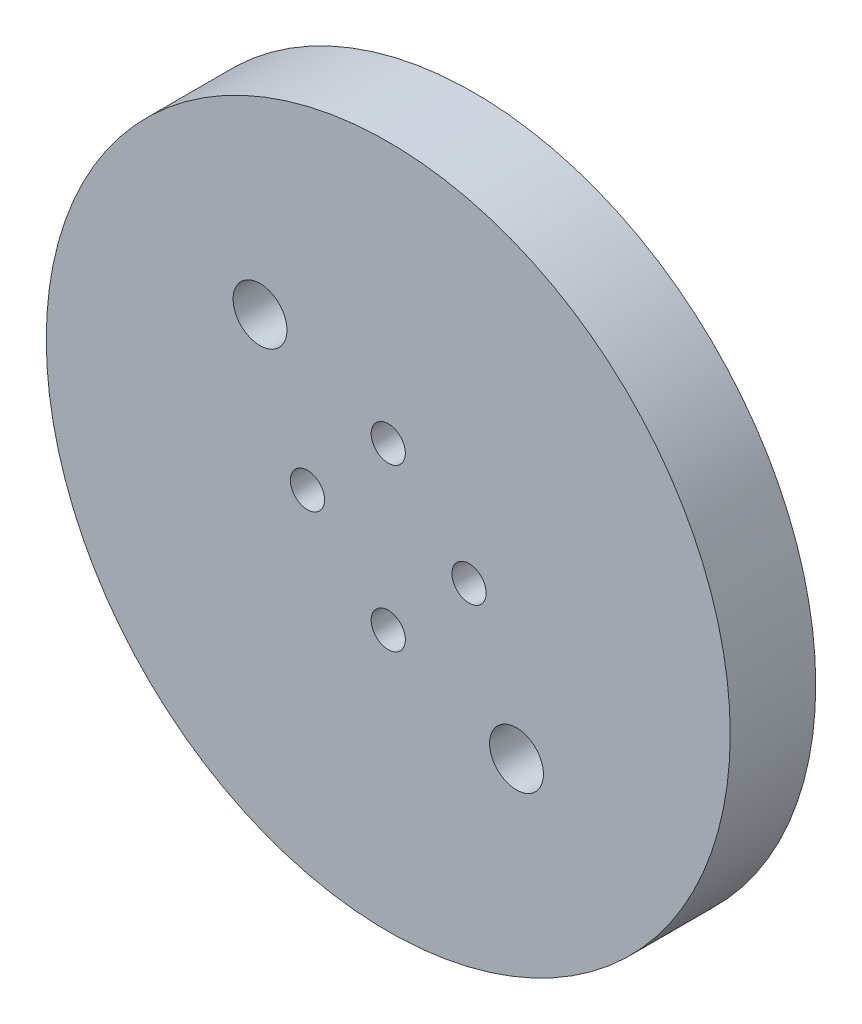
ISO-10303-21;
HEADER;
FILE_DESCRIPTION(('STEP AP214'),'2;1');
FILE_NAME('part.step','',(''),(''),'','','');
FILE_SCHEMA(('AUTOMOTIVE_DESIGN { 1 0 10303 214 1 1 1 1 }'));
ENDSEC;
DATA;
#1=APPLICATION_CONTEXT('core data for automotive mechanical design processes');
#2=APPLICATION_PROTOCOL_DEFINITION('international standard','automotive_design',2000,#1);
#3=PRODUCT_CONTEXT('',#1,'mechanical');
#4=PRODUCT('Part','Part','',(#3));
#5=PRODUCT_RELATED_PRODUCT_CATEGORY('part','',(#4));
#6=PRODUCT_DEFINITION_FORMATION('','',#4);
#7=PRODUCT_DEFINITION_CONTEXT('part definition',#1,'design');
#8=PRODUCT_DEFINITION('design','',#6,#7);
#9=PRODUCT_DEFINITION_SHAPE('','',#8);
#10=(LENGTH_UNIT() NAMED_UNIT(*) SI_UNIT(.MILLI.,.METRE.));
#11=(NAMED_UNIT(*) PLANE_ANGLE_UNIT() SI_UNIT($,.RADIAN.));
#12=(NAMED_UNIT(*) SI_UNIT($,.STERADIAN.) SOLID_ANGLE_UNIT());
#13=UNCERTAINTY_MEASURE_WITH_UNIT(LENGTH_MEASURE(1.E-05),#10,'distance_accuracy_value','');
#14=(GEOMETRIC_REPRESENTATION_CONTEXT(3) GLOBAL_UNCERTAINTY_ASSIGNED_CONTEXT((#13)) GLOBAL_UNIT_ASSIGNED_CONTEXT((#10,
#11,#12)) REPRESENTATION_CONTEXT('',''));
#15=CARTESIAN_POINT('',(0.,0.,0.));
#16=DIRECTION('',(0.,0.,1.));
#17=DIRECTION('',(1.,0.,0.));
#18=AXIS2_PLACEMENT_3D('',#15,#16,#17);
#19=CARTESIAN_POINT('',(0.,0.,12.7));
#20=DIRECTION('',(0.,0.,1.));
#21=DIRECTION('',(1.,0.,0.));
#22=AXIS2_PLACEMENT_3D('',#19,#20,#21);
#23=PLANE('',#22);
#24=CARTESIAN_POINT('',(-19.05,19.05,12.7));
#25=DIRECTION('',(0.,0.,1.));
#26=DIRECTION('',(1.,0.,0.));
#27=AXIS2_PLACEMENT_3D('',#24,#25,#26);
#28=CIRCLE('',#27,4.);
#29=CARTESIAN_POINT('',(-15.05,19.05,12.7));
#30=VERTEX_POINT('',#29);
#31=EDGE_CURVE('E80',#30,#30,#28,.T.);
#32=ORIENTED_EDGE('',*,*,#31,.F.);
#33=EDGE_LOOP('',(#32));
#34=FACE_BOUND('',#33,.T.);
#35=CARTESIAN_POINT('',(19.05,-19.05,12.7));
#36=DIRECTION('',(0.,0.,1.));
#37=DIRECTION('',(1.,0.,0.));
#38=AXIS2_PLACEMENT_3D('',#35,#36,#37);
#39=CIRCLE('',#38,4.);
#40=CARTESIAN_POINT('',(23.05,-19.05,12.7));
#41=VERTEX_POINT('',#40);
#42=EDGE_CURVE('E64',#41,#41,#39,.T.);
#43=ORIENTED_EDGE('',*,*,#42,.F.);
#44=EDGE_LOOP('',(#43));
#45=FACE_BOUND('',#44,.T.);
#46=CARTESIAN_POINT('',(-12.,0.,12.7));
#47=DIRECTION('',(0.,0.,1.));
#48=DIRECTION('',(1.,0.,0.));
#49=AXIS2_PLACEMENT_3D('',#46,#47,#48);
#50=CIRCLE('',#49,2.54);
#51=CARTESIAN_POINT('',(-9.46,0.,12.7));
#52=VERTEX_POINT('',#51);
#53=EDGE_CURVE('E93',#52,#52,#50,.T.);
#54=ORIENTED_EDGE('',*,*,#53,.F.);
#55=EDGE_LOOP('',(#54));
#56=FACE_BOUND('',#55,.T.);
#57=CARTESIAN_POINT('',(12.,0.,12.7));
#58=DIRECTION('',(0.,0.,1.));
#59=DIRECTION('',(1.,0.,0.));
#60=AXIS2_PLACEMENT_3D('',#57,#58,#59);
#61=CIRCLE('',#60,2.54);
#62=CARTESIAN_POINT('',(14.54,0.,12.7));
#63=VERTEX_POINT('',#62);
#64=EDGE_CURVE('E56',#63,#63,#61,.T.);
#65=ORIENTED_EDGE('',*,*,#64,.F.);
#66=EDGE_LOOP('',(#65));
#67=FACE_BOUND('',#66,.T.);
#68=CARTESIAN_POINT('',(0.,0.,12.7));
#69=DIRECTION('',(0.,0.,1.));
#70=DIRECTION('',(1.,0.,0.));
#71=AXIS2_PLACEMENT_3D('',#68,#69,#70);
#72=CIRCLE('',#71,50.8);
#73=CARTESIAN_POINT('',(50.8,0.,12.7));
#74=VERTEX_POINT('',#73);
#75=EDGE_CURVE('E10',#74,#74,#72,.T.);
#76=ORIENTED_EDGE('',*,*,#75,.T.);
#77=EDGE_LOOP('',(#76));
#78=FACE_BOUND('',#77,.T.);
#79=CARTESIAN_POINT('',(0.,-12.,12.7));
#80=DIRECTION('',(0.,0.,1.));
#81=DIRECTION('',(1.,0.,0.));
#82=AXIS2_PLACEMENT_3D('',#79,#80,#81);
#83=CIRCLE('',#82,2.54);
#84=CARTESIAN_POINT('',(2.54,-12.,12.7));
#85=VERTEX_POINT('',#84);
#86=EDGE_CURVE('E101',#85,#85,#83,.T.);
#87=ORIENTED_EDGE('',*,*,#86,.F.);
#88=EDGE_LOOP('',(#87));
#89=FACE_BOUND('',#88,.T.);
#90=CARTESIAN_POINT('',(0.,12.,12.7));
#91=DIRECTION('',(0.,0.,1.));
#92=DIRECTION('',(1.,0.,0.));
#93=AXIS2_PLACEMENT_3D('',#90,#91,#92);
#94=CIRCLE('',#93,2.54);
#95=CARTESIAN_POINT('',(2.54,12.,12.7));
#96=VERTEX_POINT('',#95);
#97=EDGE_CURVE('E85',#96,#96,#94,.T.);
#98=ORIENTED_EDGE('',*,*,#97,.F.);
#99=EDGE_LOOP('',(#98));
#100=FACE_BOUND('',#99,.T.);
#101=ADVANCED_FACE('F41',(#34,#45,#56,#67,#78,#89,#100),#23,.T.);
#102=CARTESIAN_POINT('',(0.,0.,0.));
#103=DIRECTION('',(0.,0.,1.));
#104=DIRECTION('',(1.,0.,0.));
#105=AXIS2_PLACEMENT_3D('',#102,#103,#104);
#106=PLANE('',#105);
#107=CARTESIAN_POINT('',(-19.05,19.05,0.));
#108=DIRECTION('',(0.,0.,1.));
#109=DIRECTION('',(1.,0.,0.));
#110=AXIS2_PLACEMENT_3D('',#107,#108,#109);
#111=CIRCLE('',#110,12.7);
#112=CARTESIAN_POINT('',(-6.35,19.05,0.));
#113=VERTEX_POINT('',#112);
#114=EDGE_CURVE('E191',#113,#113,#111,.T.);
#115=ORIENTED_EDGE('',*,*,#114,.T.);
#116=EDGE_LOOP('',(#115));
#117=FACE_BOUND('',#116,.T.);
#118=CARTESIAN_POINT('',(19.05,-19.05,0.));
#119=DIRECTION('',(0.,0.,1.));
#120=DIRECTION('',(1.,0.,0.));
#121=AXIS2_PLACEMENT_3D('',#118,#119,#120);
#122=CIRCLE('',#121,12.7);
#123=CARTESIAN_POINT('',(31.75,-19.05,0.));
#124=VERTEX_POINT('',#123);
#125=EDGE_CURVE('E74',#124,#124,#122,.T.);
#126=ORIENTED_EDGE('',*,*,#125,.T.);
#127=EDGE_LOOP('',(#126));
#128=FACE_BOUND('',#127,.T.);
#129=CARTESIAN_POINT('',(0.,0.,0.));
#130=DIRECTION('',(0.,0.,1.));
#131=DIRECTION('',(1.,0.,0.));
#132=AXIS2_PLACEMENT_3D('',#129,#130,#131);
#133=CIRCLE('',#132,50.8);
#134=CARTESIAN_POINT('',(50.8,0.,0.));
#135=VERTEX_POINT('',#134);
#136=EDGE_CURVE('E50',#135,#135,#133,.T.);
#137=ORIENTED_EDGE('',*,*,#136,.F.);
#138=EDGE_LOOP('',(#137));
#139=FACE_BOUND('',#138,.T.);
#140=CARTESIAN_POINT('',(12.,0.,0.));
#141=DIRECTION('',(0.,0.,1.));
#142=DIRECTION('',(1.,0.,0.));
#143=AXIS2_PLACEMENT_3D('',#140,#141,#142);
#144=CIRCLE('',#143,2.54);
#145=CARTESIAN_POINT('',(14.54,0.,0.));
#146=VERTEX_POINT('',#145);
#147=EDGE_CURVE('E59',#146,#146,#144,.T.);
#148=ORIENTED_EDGE('',*,*,#147,.T.);
#149=EDGE_LOOP('',(#148));
#150=FACE_BOUND('',#149,.T.);
#151=CARTESIAN_POINT('',(0.,-12.,0.));
#152=DIRECTION('',(0.,0.,1.));
#153=DIRECTION('',(1.,0.,0.));
#154=AXIS2_PLACEMENT_3D('',#151,#152,#153);
#155=CIRCLE('',#154,2.54);
#156=CARTESIAN_POINT('',(2.54,-12.,0.));
#157=VERTEX_POINT('',#156);
#158=EDGE_CURVE('E97',#157,#157,#155,.T.);
#159=ORIENTED_EDGE('',*,*,#158,.T.);
#160=EDGE_LOOP('',(#159));
#161=FACE_BOUND('',#160,.T.);
#162=CARTESIAN_POINT('',(-12.,0.,0.));
#163=DIRECTION('',(0.,0.,1.));
#164=DIRECTION('',(1.,0.,0.));
#165=AXIS2_PLACEMENT_3D('',#162,#163,#164);
#166=CIRCLE('',#165,2.54);
#167=CARTESIAN_POINT('',(-9.46,0.,0.));
#168=VERTEX_POINT('',#167);
#169=EDGE_CURVE('E89',#168,#168,#166,.T.);
#170=ORIENTED_EDGE('',*,*,#169,.T.);
#171=EDGE_LOOP('',(#170));
#172=FACE_BOUND('',#171,.T.);
#173=CARTESIAN_POINT('',(0.,12.,0.));
#174=DIRECTION('',(0.,0.,1.));
#175=DIRECTION('',(1.,0.,0.));
#176=AXIS2_PLACEMENT_3D('',#173,#174,#175);
#177=CIRCLE('',#176,2.54);
#178=CARTESIAN_POINT('',(2.54,12.,0.));
#179=VERTEX_POINT('',#178);
#180=EDGE_CURVE('E71',#179,#179,#177,.T.);
#181=ORIENTED_EDGE('',*,*,#180,.T.);
#182=EDGE_LOOP('',(#181));
#183=FACE_BOUND('',#182,.T.);
#184=ADVANCED_FACE('F115',(#117,#128,#139,#150,#161,#172,#183),#106,.F.);
#185=CARTESIAN_POINT('',(0.,0.,12.7));
#186=DIRECTION('',(0.,0.,-1.));
#187=DIRECTION('',(-1.,0.,0.));
#188=AXIS2_PLACEMENT_3D('',#185,#186,#187);
#189=CYLINDRICAL_SURFACE('',#188,50.8);
#190=ORIENTED_EDGE('',*,*,#75,.F.);
#191=EDGE_LOOP('',(#190));
#192=FACE_BOUND('',#191,.T.);
#193=ORIENTED_EDGE('',*,*,#136,.T.);
#194=EDGE_LOOP('',(#193));
#195=FACE_BOUND('',#194,.T.);
#196=ADVANCED_FACE('F43',(#192,#195),#189,.T.);
#197=CARTESIAN_POINT('',(12.,0.,12.7));
#198=DIRECTION('',(0.,0.,-1.));
#199=DIRECTION('',(-1.,0.,0.));
#200=AXIS2_PLACEMENT_3D('',#197,#198,#199);
#201=CYLINDRICAL_SURFACE('',#200,2.54);
#202=ORIENTED_EDGE('',*,*,#64,.T.);
#203=EDGE_LOOP('',(#202));
#204=FACE_BOUND('',#203,.T.);
#205=ORIENTED_EDGE('',*,*,#147,.F.);
#206=EDGE_LOOP('',(#205));
#207=FACE_BOUND('',#206,.T.);
#208=ADVANCED_FACE('F118',(#204,#207),#201,.F.);
#209=CARTESIAN_POINT('',(0.,-12.,12.7));
#210=DIRECTION('',(0.,0.,-1.));
#211=DIRECTION('',(-1.,0.,0.));
#212=AXIS2_PLACEMENT_3D('',#209,#210,#211);
#213=CYLINDRICAL_SURFACE('',#212,2.54);
#214=ORIENTED_EDGE('',*,*,#86,.T.);
#215=EDGE_LOOP('',(#214));
#216=FACE_BOUND('',#215,.T.);
#217=ORIENTED_EDGE('',*,*,#158,.F.);
#218=EDGE_LOOP('',(#217));
#219=FACE_BOUND('',#218,.T.);
#220=ADVANCED_FACE('F120',(#216,#219),#213,.F.);
#221=CARTESIAN_POINT('',(-12.,0.,12.7));
#222=DIRECTION('',(0.,0.,-1.));
#223=DIRECTION('',(-1.,0.,0.));
#224=AXIS2_PLACEMENT_3D('',#221,#222,#223);
#225=CYLINDRICAL_SURFACE('',#224,2.54);
#226=ORIENTED_EDGE('',*,*,#53,.T.);
#227=EDGE_LOOP('',(#226));
#228=FACE_BOUND('',#227,.T.);
#229=ORIENTED_EDGE('',*,*,#169,.F.);
#230=EDGE_LOOP('',(#229));
#231=FACE_BOUND('',#230,.T.);
#232=ADVANCED_FACE('F126',(#228,#231),#225,.F.);
#233=CARTESIAN_POINT('',(0.,12.,12.7));
#234=DIRECTION('',(0.,0.,-1.));
#235=DIRECTION('',(-1.,0.,0.));
#236=AXIS2_PLACEMENT_3D('',#233,#234,#235);
#237=CYLINDRICAL_SURFACE('',#236,2.54);
#238=ORIENTED_EDGE('',*,*,#97,.T.);
#239=EDGE_LOOP('',(#238));
#240=FACE_BOUND('',#239,.T.);
#241=ORIENTED_EDGE('',*,*,#180,.F.);
#242=EDGE_LOOP('',(#241));
#243=FACE_BOUND('',#242,.T.);
#244=ADVANCED_FACE('F149',(#240,#243),#237,.F.);
#245=CARTESIAN_POINT('',(19.05,-19.05,12.7));
#246=DIRECTION('',(0.,0.,-1.));
#247=DIRECTION('',(-1.,0.,0.));
#248=AXIS2_PLACEMENT_3D('',#245,#246,#247);
#249=CYLINDRICAL_SURFACE('',#248,4.);
#250=CARTESIAN_POINT('',(19.05,-19.05,6.35));
#251=DIRECTION('',(0.,0.,1.));
#252=DIRECTION('',(1.,0.,0.));
#253=AXIS2_PLACEMENT_3D('',#250,#251,#252);
#254=CIRCLE('',#253,4.);
#255=CARTESIAN_POINT('',(23.05,-19.05,6.35));
#256=VERTEX_POINT('',#255);
#257=EDGE_CURVE('E61',#256,#256,#254,.T.);
#258=ORIENTED_EDGE('',*,*,#257,.F.);
#259=EDGE_LOOP('',(#258));
#260=FACE_BOUND('',#259,.T.);
#261=ORIENTED_EDGE('',*,*,#42,.T.);
#262=EDGE_LOOP('',(#261));
#263=FACE_BOUND('',#262,.T.);
#264=ADVANCED_FACE('F152',(#260,#263),#249,.F.);
#265=CARTESIAN_POINT('',(19.05,-19.05,6.35));
#266=DIRECTION('',(0.,0.,-1.));
#267=DIRECTION('',(-1.,0.,0.));
#268=AXIS2_PLACEMENT_3D('',#265,#266,#267);
#269=CYLINDRICAL_SURFACE('',#268,12.7);
#270=CARTESIAN_POINT('',(19.05,-19.05,6.35));
#271=DIRECTION('',(0.,0.,1.));
#272=DIRECTION('',(1.,0.,0.));
#273=AXIS2_PLACEMENT_3D('',#270,#271,#272);
#274=CIRCLE('',#273,12.7);
#275=CARTESIAN_POINT('',(31.75,-19.05,6.35));
#276=VERTEX_POINT('',#275);
#277=EDGE_CURVE('E65',#276,#276,#274,.T.);
#278=ORIENTED_EDGE('',*,*,#277,.T.);
#279=EDGE_LOOP('',(#278));
#280=FACE_BOUND('',#279,.T.);
#281=ORIENTED_EDGE('',*,*,#125,.F.);
#282=EDGE_LOOP('',(#281));
#283=FACE_BOUND('',#282,.T.);
#284=ADVANCED_FACE('F160',(#280,#283),#269,.F.);
#285=CARTESIAN_POINT('',(19.05,-19.05,6.35));
#286=DIRECTION('',(0.,0.,1.));
#287=DIRECTION('',(1.,0.,0.));
#288=AXIS2_PLACEMENT_3D('',#285,#286,#287);
#289=PLANE('',#288);
#290=ORIENTED_EDGE('',*,*,#257,.T.);
#291=EDGE_LOOP('',(#290));
#292=FACE_BOUND('',#291,.T.);
#293=ORIENTED_EDGE('',*,*,#277,.F.);
#294=EDGE_LOOP('',(#293));
#295=FACE_BOUND('',#294,.T.);
#296=ADVANCED_FACE('F168',(#292,#295),#289,.F.);
#297=CARTESIAN_POINT('',(-19.05,19.05,12.7));
#298=DIRECTION('',(0.,0.,-1.));
#299=DIRECTION('',(-1.,0.,0.));
#300=AXIS2_PLACEMENT_3D('',#297,#298,#299);
#301=CYLINDRICAL_SURFACE('',#300,4.);
#302=CARTESIAN_POINT('',(-19.05,19.05,6.35));
#303=DIRECTION('',(0.,0.,1.));
#304=DIRECTION('',(1.,0.,0.));
#305=AXIS2_PLACEMENT_3D('',#302,#303,#304);
#306=CIRCLE('',#305,4.);
#307=CARTESIAN_POINT('',(-15.05,19.05,6.35));
#308=VERTEX_POINT('',#307);
#309=EDGE_CURVE('E45',#308,#308,#306,.T.);
#310=ORIENTED_EDGE('',*,*,#309,.F.);
#311=EDGE_LOOP('',(#310));
#312=FACE_BOUND('',#311,.T.);
#313=ORIENTED_EDGE('',*,*,#31,.T.);
#314=EDGE_LOOP('',(#313));
#315=FACE_BOUND('',#314,.T.);
#316=ADVANCED_FACE('F171',(#312,#315),#301,.F.);
#317=CARTESIAN_POINT('',(-19.05,19.05,6.35));
#318=DIRECTION('',(0.,0.,-1.));
#319=DIRECTION('',(-1.,0.,0.));
#320=AXIS2_PLACEMENT_3D('',#317,#318,#319);
#321=CYLINDRICAL_SURFACE('',#320,12.7);
#322=CARTESIAN_POINT('',(-19.05,19.05,6.35));
#323=DIRECTION('',(0.,0.,1.));
#324=DIRECTION('',(1.,0.,0.));
#325=AXIS2_PLACEMENT_3D('',#322,#323,#324);
#326=CIRCLE('',#325,12.7);
#327=CARTESIAN_POINT('',(-6.35,19.05,6.35));
#328=VERTEX_POINT('',#327);
#329=EDGE_CURVE('E189',#328,#328,#326,.T.);
#330=ORIENTED_EDGE('',*,*,#329,.T.);
#331=EDGE_LOOP('',(#330));
#332=FACE_BOUND('',#331,.T.);
#333=ORIENTED_EDGE('',*,*,#114,.F.);
#334=EDGE_LOOP('',(#333));
#335=FACE_BOUND('',#334,.T.);
#336=ADVANCED_FACE('F174',(#332,#335),#321,.F.);
#337=CARTESIAN_POINT('',(-19.05,19.05,6.35));
#338=DIRECTION('',(0.,0.,1.));
#339=DIRECTION('',(1.,0.,0.));
#340=AXIS2_PLACEMENT_3D('',#337,#338,#339);
#341=PLANE('',#340);
#342=ORIENTED_EDGE('',*,*,#309,.T.);
#343=EDGE_LOOP('',(#342));
#344=FACE_BOUND('',#343,.T.);
#345=ORIENTED_EDGE('',*,*,#329,.F.);
#346=EDGE_LOOP('',(#345));
#347=FACE_BOUND('',#346,.T.);
#348=ADVANCED_FACE('F178',(#344,#347),#341,.F.);
#349=CLOSED_SHELL('',(#101,#184,#196,#208,#220,#232,#244,#264,#284,#296,#316,#336,#348));
#350=MANIFOLD_SOLID_BREP('B2',#349);
#351=ADVANCED_BREP_SHAPE_REPRESENTATION('',(#18,#350),#14);
#352=SHAPE_DEFINITION_REPRESENTATION(#9,#351);
ENDSEC;
END-ISO-10303-21;
